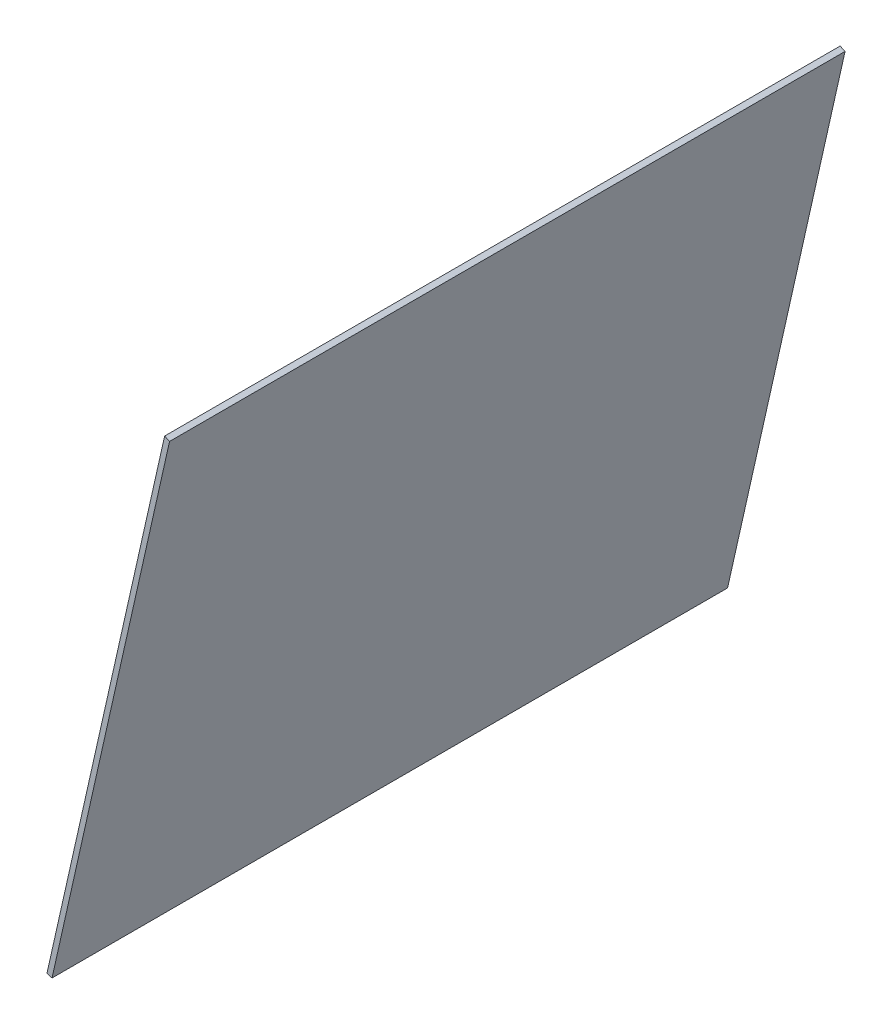
ISO-10303-21;
HEADER;
FILE_DESCRIPTION(('STEP AP214'),'2;1');
FILE_NAME('part.step','',(''),(''),'','','');
FILE_SCHEMA(('AUTOMOTIVE_DESIGN { 1 0 10303 214 1 1 1 1 }'));
ENDSEC;
DATA;
#1=APPLICATION_CONTEXT('core data for automotive mechanical design processes');
#2=APPLICATION_PROTOCOL_DEFINITION('international standard','automotive_design',2000,#1);
#3=PRODUCT_CONTEXT('',#1,'mechanical');
#4=PRODUCT('Part','Part','',(#3));
#5=PRODUCT_RELATED_PRODUCT_CATEGORY('part','',(#4));
#6=PRODUCT_DEFINITION_FORMATION('','',#4);
#7=PRODUCT_DEFINITION_CONTEXT('part definition',#1,'design');
#8=PRODUCT_DEFINITION('design','',#6,#7);
#9=PRODUCT_DEFINITION_SHAPE('','',#8);
#10=(LENGTH_UNIT() NAMED_UNIT(*) SI_UNIT(.MILLI.,.METRE.));
#11=(NAMED_UNIT(*) PLANE_ANGLE_UNIT() SI_UNIT($,.RADIAN.));
#12=(NAMED_UNIT(*) SI_UNIT($,.STERADIAN.) SOLID_ANGLE_UNIT());
#13=UNCERTAINTY_MEASURE_WITH_UNIT(LENGTH_MEASURE(1.E-05),#10,'distance_accuracy_value','');
#14=(GEOMETRIC_REPRESENTATION_CONTEXT(3) GLOBAL_UNCERTAINTY_ASSIGNED_CONTEXT((#13)) GLOBAL_UNIT_ASSIGNED_CONTEXT((#10,
#11,#12)) REPRESENTATION_CONTEXT('',''));
#15=CARTESIAN_POINT('',(0.,0.,0.));
#16=DIRECTION('',(0.,0.,1.));
#17=DIRECTION('',(1.,0.,0.));
#18=AXIS2_PLACEMENT_3D('',#15,#16,#17);
#19=CARTESIAN_POINT('',(-110.603151516067,958.636482433697,812.8));
#20=DIRECTION('',(-0.413802944301197,-0.910366477462599,0.));
#21=DIRECTION('',(0.910366477462599,-0.413802944301197,0.));
#22=AXIS2_PLACEMENT_3D('',#19,#20,#21);
#23=PLANE('',#22);
#24=DIRECTION('',(-0.910366477462599,0.413802944301197,0.));
#25=VECTOR('',#24,1.);
#26=CARTESIAN_POINT('',(-110.603151516067,958.636482433697,0.));
#27=LINE('',#26,#25);
#28=CARTESIAN_POINT('',(-104.697708181826,955.952190009042,0.));
#29=VERTEX_POINT('',#28);
#30=CARTESIAN_POINT('',(-110.603151516067,958.636482433697,0.));
#31=VERTEX_POINT('',#30);
#32=EDGE_CURVE('E96',#29,#31,#27,.T.);
#33=ORIENTED_EDGE('',*,*,#32,.T.);
#34=DIRECTION('',(0.,0.,-1.));
#35=VECTOR('',#34,1.);
#36=CARTESIAN_POINT('',(-110.603151516067,958.636482433697,812.8));
#37=LINE('',#36,#35);
#38=CARTESIAN_POINT('',(-110.603151516067,958.636482433697,812.8));
#39=VERTEX_POINT('',#38);
#40=EDGE_CURVE('E11',#39,#31,#37,.T.);
#41=ORIENTED_EDGE('',*,*,#40,.F.);
#42=DIRECTION('',(-0.910366477462599,0.413802944301197,0.));
#43=VECTOR('',#42,1.);
#44=CARTESIAN_POINT('',(-110.603151516067,958.636482433697,812.8));
#45=LINE('',#44,#43);
#46=CARTESIAN_POINT('',(-104.697708181826,955.952190009042,812.8));
#47=VERTEX_POINT('',#46);
#48=EDGE_CURVE('E84',#47,#39,#45,.T.);
#49=ORIENTED_EDGE('',*,*,#48,.F.);
#50=DIRECTION('',(0.,0.,-1.));
#51=VECTOR('',#50,1.);
#52=CARTESIAN_POINT('',(-104.697708181826,955.952190009042,812.8));
#53=LINE('',#52,#51);
#54=EDGE_CURVE('E92',#47,#29,#53,.T.);
#55=ORIENTED_EDGE('',*,*,#54,.T.);
#56=EDGE_LOOP('',(#33,#41,#49,#55));
#57=FACE_BOUND('',#56,.T.);
#58=ADVANCED_FACE('F33',(#57),#23,.F.);
#59=CARTESIAN_POINT('',(-110.603151516067,958.636482433697,812.8));
#60=DIRECTION('',(0.97571625209357,-0.21903834230672,0.));
#61=DIRECTION('',(0.21903834230672,0.97571625209357,0.));
#62=AXIS2_PLACEMENT_3D('',#59,#60,#61);
#63=PLANE('',#62);
#64=DIRECTION('',(-0.21903834230672,-0.97571625209357,0.));
#65=VECTOR('',#64,1.);
#66=CARTESIAN_POINT('',(-110.603151516067,958.636482433697,0.));
#67=LINE('',#66,#65);
#68=CARTESIAN_POINT('',(-252.220463645069,327.795728404507,0.));
#69=VERTEX_POINT('',#68);
#70=EDGE_CURVE('E88',#31,#69,#67,.T.);
#71=ORIENTED_EDGE('',*,*,#70,.T.);
#72=DIRECTION('',(0.,0.,-1.));
#73=VECTOR('',#72,1.);
#74=CARTESIAN_POINT('',(-252.220463645069,327.795728404507,812.8));
#75=LINE('',#74,#73);
#76=CARTESIAN_POINT('',(-252.220463645069,327.795728404507,812.8));
#77=VERTEX_POINT('',#76);
#78=EDGE_CURVE('E41',#77,#69,#75,.T.);
#79=ORIENTED_EDGE('',*,*,#78,.F.);
#80=DIRECTION('',(-0.21903834230672,-0.97571625209357,0.));
#81=VECTOR('',#80,1.);
#82=CARTESIAN_POINT('',(-110.603151516067,958.636482433697,812.8));
#83=LINE('',#82,#81);
#84=EDGE_CURVE('E79',#39,#77,#83,.T.);
#85=ORIENTED_EDGE('',*,*,#84,.F.);
#86=ORIENTED_EDGE('',*,*,#40,.T.);
#87=EDGE_LOOP('',(#71,#79,#85,#86));
#88=FACE_BOUND('',#87,.T.);
#89=ADVANCED_FACE('F87',(#88),#63,.F.);
#90=CARTESIAN_POINT('',(-252.220463645069,327.795728404507,812.8));
#91=DIRECTION('',(0.260362499760686,0.96551093661251,0.));
#92=DIRECTION('',(-0.96551093661251,0.260362499760686,0.));
#93=AXIS2_PLACEMENT_3D('',#90,#91,#92);
#94=PLANE('',#93);
#95=DIRECTION('',(0.96551093661251,-0.260362499760686,0.));
#96=VECTOR('',#95,1.);
#97=CARTESIAN_POINT('',(-252.220463645069,327.795728404507,0.));
#98=LINE('',#97,#96);
#99=CARTESIAN_POINT('',(-246.083909987909,326.140927418307,0.));
#100=VERTEX_POINT('',#99);
#101=EDGE_CURVE('E66',#69,#100,#98,.T.);
#102=ORIENTED_EDGE('',*,*,#101,.T.);
#103=DIRECTION('',(0.,0.,-1.));
#104=VECTOR('',#103,1.);
#105=CARTESIAN_POINT('',(-246.083909987909,326.140927418307,812.8));
#106=LINE('',#105,#104);
#107=CARTESIAN_POINT('',(-246.083909987909,326.140927418307,812.8));
#108=VERTEX_POINT('',#107);
#109=EDGE_CURVE('E89',#108,#100,#106,.T.);
#110=ORIENTED_EDGE('',*,*,#109,.F.);
#111=DIRECTION('',(0.96551093661251,-0.260362499760686,0.));
#112=VECTOR('',#111,1.);
#113=CARTESIAN_POINT('',(-252.220463645069,327.795728404507,812.8));
#114=LINE('',#113,#112);
#115=EDGE_CURVE('E82',#77,#108,#114,.T.);
#116=ORIENTED_EDGE('',*,*,#115,.F.);
#117=ORIENTED_EDGE('',*,*,#78,.T.);
#118=EDGE_LOOP('',(#102,#110,#116,#117));
#119=FACE_BOUND('',#118,.T.);
#120=ADVANCED_FACE('F90',(#119),#94,.F.);
#121=CARTESIAN_POINT('',(-104.697708181826,955.952190009042,812.8));
#122=DIRECTION('',(-0.97571625209357,0.21903834230672,0.));
#123=DIRECTION('',(-0.21903834230672,-0.97571625209357,0.));
#124=AXIS2_PLACEMENT_3D('',#121,#122,#123);
#125=PLANE('',#124);
#126=DIRECTION('',(0.21903834230672,0.97571625209357,0.));
#127=VECTOR('',#126,1.);
#128=CARTESIAN_POINT('',(-104.697708181826,955.952190009042,0.));
#129=LINE('',#128,#127);
#130=EDGE_CURVE('E72',#100,#29,#129,.T.);
#131=ORIENTED_EDGE('',*,*,#130,.T.);
#132=ORIENTED_EDGE('',*,*,#54,.F.);
#133=DIRECTION('',(0.21903834230672,0.97571625209357,0.));
#134=VECTOR('',#133,1.);
#135=CARTESIAN_POINT('',(-104.697708181826,955.952190009042,812.8));
#136=LINE('',#135,#134);
#137=EDGE_CURVE('E49',#108,#47,#136,.T.);
#138=ORIENTED_EDGE('',*,*,#137,.F.);
#139=ORIENTED_EDGE('',*,*,#109,.T.);
#140=EDGE_LOOP('',(#131,#132,#138,#139));
#141=FACE_BOUND('',#140,.T.);
#142=ADVANCED_FACE('F103',(#141),#125,.F.);
#143=CARTESIAN_POINT('',(0.,0.,812.8));
#144=DIRECTION('',(0.,0.,-1.));
#145=DIRECTION('',(-1.,0.,0.));
#146=AXIS2_PLACEMENT_3D('',#143,#144,#145);
#147=PLANE('',#146);
#148=ORIENTED_EDGE('',*,*,#48,.T.);
#149=ORIENTED_EDGE('',*,*,#84,.T.);
#150=ORIENTED_EDGE('',*,*,#115,.T.);
#151=ORIENTED_EDGE('',*,*,#137,.T.);
#152=EDGE_LOOP('',(#148,#149,#150,#151));
#153=FACE_BOUND('',#152,.T.);
#154=ADVANCED_FACE('F80',(#153),#147,.F.);
#155=CARTESIAN_POINT('',(0.,0.,0.));
#156=DIRECTION('',(0.,0.,-1.));
#157=DIRECTION('',(-1.,0.,0.));
#158=AXIS2_PLACEMENT_3D('',#155,#156,#157);
#159=PLANE('',#158);
#160=ORIENTED_EDGE('',*,*,#32,.F.);
#161=ORIENTED_EDGE('',*,*,#130,.F.);
#162=ORIENTED_EDGE('',*,*,#101,.F.);
#163=ORIENTED_EDGE('',*,*,#70,.F.);
#164=EDGE_LOOP('',(#160,#161,#162,#163));
#165=FACE_BOUND('',#164,.T.);
#166=ADVANCED_FACE('F106',(#165),#159,.T.);
#167=CLOSED_SHELL('',(#58,#89,#120,#142,#154,#166));
#168=MANIFOLD_SOLID_BREP('B2',#167);
#169=ADVANCED_BREP_SHAPE_REPRESENTATION('',(#18,#168),#14);
#170=SHAPE_DEFINITION_REPRESENTATION(#9,#169);
ENDSEC;
END-ISO-10303-21;
